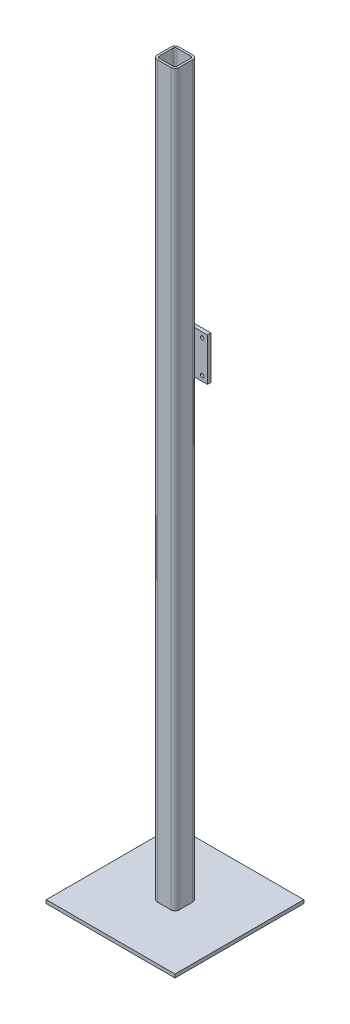
ISO-10303-21;
HEADER;
FILE_DESCRIPTION(('STEP AP214'),'2;1');
FILE_NAME('part.step','',(''),(''),'','','');
FILE_SCHEMA(('AUTOMOTIVE_DESIGN { 1 0 10303 214 1 1 1 1 }'));
ENDSEC;
DATA;
#1=APPLICATION_CONTEXT('core data for automotive mechanical design processes');
#2=APPLICATION_PROTOCOL_DEFINITION('international standard','automotive_design',2000,#1);
#3=PRODUCT_CONTEXT('',#1,'mechanical');
#4=PRODUCT('Part','Part','',(#3));
#5=PRODUCT_RELATED_PRODUCT_CATEGORY('part','',(#4));
#6=PRODUCT_DEFINITION_FORMATION('','',#4);
#7=PRODUCT_DEFINITION_CONTEXT('part definition',#1,'design');
#8=PRODUCT_DEFINITION('design','',#6,#7);
#9=PRODUCT_DEFINITION_SHAPE('','',#8);
#10=(LENGTH_UNIT() NAMED_UNIT(*) SI_UNIT(.MILLI.,.METRE.));
#11=(NAMED_UNIT(*) PLANE_ANGLE_UNIT() SI_UNIT($,.RADIAN.));
#12=(NAMED_UNIT(*) SI_UNIT($,.STERADIAN.) SOLID_ANGLE_UNIT());
#13=UNCERTAINTY_MEASURE_WITH_UNIT(LENGTH_MEASURE(1.E-05),#10,'distance_accuracy_value','');
#14=(GEOMETRIC_REPRESENTATION_CONTEXT(3) GLOBAL_UNCERTAINTY_ASSIGNED_CONTEXT((#13)) GLOBAL_UNIT_ASSIGNED_CONTEXT((#10,
#11,#12)) REPRESENTATION_CONTEXT('',''));
#15=CARTESIAN_POINT('',(0.,0.,0.));
#16=DIRECTION('',(0.,0.,1.));
#17=DIRECTION('',(1.,0.,0.));
#18=AXIS2_PLACEMENT_3D('',#15,#16,#17);
#19=CARTESIAN_POINT('',(0.,0.,-33.4));
#20=DIRECTION('',(0.,0.,-1.));
#21=DIRECTION('',(-1.,0.,0.));
#22=AXIS2_PLACEMENT_3D('',#19,#20,#21);
#23=PLANE('',#22);
#24=CARTESIAN_POINT('',(-38.,1064.,-33.4));
#25=DIRECTION('',(0.,0.,-1.));
#26=DIRECTION('',(-1.,0.,0.));
#27=AXIS2_PLACEMENT_3D('',#24,#25,#26);
#28=CIRCLE('',#27,4.09999999999994);
#29=CARTESIAN_POINT('',(-42.0999999999999,1064.,-33.4));
#30=VERTEX_POINT('',#29);
#31=EDGE_CURVE('E166',#30,#30,#28,.T.);
#32=ORIENTED_EDGE('',*,*,#31,.F.);
#33=EDGE_LOOP('',(#32));
#34=FACE_BOUND('',#33,.T.);
#35=CARTESIAN_POINT('',(38.,1140.,-33.4));
#36=DIRECTION('',(0.,0.,-1.));
#37=DIRECTION('',(-1.,0.,0.));
#38=AXIS2_PLACEMENT_3D('',#35,#36,#37);
#39=CIRCLE('',#38,4.09999999999994);
#40=CARTESIAN_POINT('',(33.9000000000001,1140.,-33.4));
#41=VERTEX_POINT('',#40);
#42=EDGE_CURVE('E145',#41,#41,#39,.T.);
#43=ORIENTED_EDGE('',*,*,#42,.F.);
#44=EDGE_LOOP('',(#43));
#45=FACE_BOUND('',#44,.T.);
#46=DIRECTION('',(0.,1.,0.));
#47=VECTOR('',#46,1.);
#48=CARTESIAN_POINT('',(-50.,1152.,-33.4));
#49=LINE('',#48,#47);
#50=CARTESIAN_POINT('',(-50.,1052.,-33.4));
#51=VERTEX_POINT('',#50);
#52=CARTESIAN_POINT('',(-50.,1152.,-33.4));
#53=VERTEX_POINT('',#52);
#54=EDGE_CURVE('E130',#51,#53,#49,.T.);
#55=ORIENTED_EDGE('',*,*,#54,.T.);
#56=DIRECTION('',(1.,0.,0.));
#57=VECTOR('',#56,1.);
#58=CARTESIAN_POINT('',(50.,1152.,-33.4));
#59=LINE('',#58,#57);
#60=CARTESIAN_POINT('',(50.,1152.,-33.4));
#61=VERTEX_POINT('',#60);
#62=EDGE_CURVE('E125',#53,#61,#59,.T.);
#63=ORIENTED_EDGE('',*,*,#62,.T.);
#64=DIRECTION('',(0.,-1.,0.));
#65=VECTOR('',#64,1.);
#66=CARTESIAN_POINT('',(50.,1152.,-33.4));
#67=LINE('',#66,#65);
#68=CARTESIAN_POINT('',(50.,1052.,-33.4));
#69=VERTEX_POINT('',#68);
#70=EDGE_CURVE('E128',#61,#69,#67,.T.);
#71=ORIENTED_EDGE('',*,*,#70,.T.);
#72=DIRECTION('',(-1.,0.,0.));
#73=VECTOR('',#72,1.);
#74=CARTESIAN_POINT('',(50.,1052.,-33.4));
#75=LINE('',#74,#73);
#76=EDGE_CURVE('E95',#69,#51,#75,.T.);
#77=ORIENTED_EDGE('',*,*,#76,.T.);
#78=EDGE_LOOP('',(#55,#63,#71,#77));
#79=FACE_BOUND('',#78,.T.);
#80=CARTESIAN_POINT('',(-38.,1140.,-33.4));
#81=DIRECTION('',(0.,0.,-1.));
#82=DIRECTION('',(-1.,0.,0.));
#83=AXIS2_PLACEMENT_3D('',#80,#81,#82);
#84=CIRCLE('',#83,4.09999999999994);
#85=CARTESIAN_POINT('',(-42.0999999999999,1140.,-33.4));
#86=VERTEX_POINT('',#85);
#87=EDGE_CURVE('E160',#86,#86,#84,.T.);
#88=ORIENTED_EDGE('',*,*,#87,.F.);
#89=EDGE_LOOP('',(#88));
#90=FACE_BOUND('',#89,.T.);
#91=CARTESIAN_POINT('',(38.,1064.,-33.4));
#92=DIRECTION('',(0.,0.,-1.));
#93=DIRECTION('',(-1.,0.,0.));
#94=AXIS2_PLACEMENT_3D('',#91,#92,#93);
#95=CIRCLE('',#94,4.09999999999994);
#96=CARTESIAN_POINT('',(33.9000000000001,1064.,-33.4));
#97=VERTEX_POINT('',#96);
#98=EDGE_CURVE('E172',#97,#97,#95,.T.);
#99=ORIENTED_EDGE('',*,*,#98,.F.);
#100=EDGE_LOOP('',(#99));
#101=FACE_BOUND('',#100,.T.);
#102=ADVANCED_FACE('F78',(#34,#45,#79,#90,#101),#23,.T.);
#103=CARTESIAN_POINT('',(0.,0.,-25.4));
#104=DIRECTION('',(0.,0.,-1.));
#105=DIRECTION('',(-1.,0.,0.));
#106=AXIS2_PLACEMENT_3D('',#103,#104,#105);
#107=PLANE('',#106);
#108=DIRECTION('',(0.,1.,0.));
#109=VECTOR('',#108,1.);
#110=CARTESIAN_POINT('',(-50.,1152.,-25.4));
#111=LINE('',#110,#109);
#112=CARTESIAN_POINT('',(-50.,1052.,-25.4));
#113=VERTEX_POINT('',#112);
#114=CARTESIAN_POINT('',(-50.,1152.,-25.4));
#115=VERTEX_POINT('',#114);
#116=EDGE_CURVE('E142',#113,#115,#111,.T.);
#117=ORIENTED_EDGE('',*,*,#116,.F.);
#118=DIRECTION('',(-1.,0.,0.));
#119=VECTOR('',#118,1.);
#120=CARTESIAN_POINT('',(50.,1052.,-25.4));
#121=LINE('',#120,#119);
#122=CARTESIAN_POINT('',(50.,1052.,-25.4));
#123=VERTEX_POINT('',#122);
#124=EDGE_CURVE('E118',#123,#113,#121,.T.);
#125=ORIENTED_EDGE('',*,*,#124,.F.);
#126=DIRECTION('',(0.,-1.,0.));
#127=VECTOR('',#126,1.);
#128=CARTESIAN_POINT('',(50.,1152.,-25.4));
#129=LINE('',#128,#127);
#130=CARTESIAN_POINT('',(50.,1152.,-25.4));
#131=VERTEX_POINT('',#130);
#132=EDGE_CURVE('E112',#131,#123,#129,.T.);
#133=ORIENTED_EDGE('',*,*,#132,.F.);
#134=DIRECTION('',(1.,0.,0.));
#135=VECTOR('',#134,1.);
#136=CARTESIAN_POINT('',(50.,1152.,-25.4));
#137=LINE('',#136,#135);
#138=EDGE_CURVE('E134',#115,#131,#137,.T.);
#139=ORIENTED_EDGE('',*,*,#138,.F.);
#140=EDGE_LOOP('',(#117,#125,#133,#139));
#141=FACE_BOUND('',#140,.T.);
#142=CARTESIAN_POINT('',(38.,1140.,-25.4));
#143=DIRECTION('',(0.,0.,-1.));
#144=DIRECTION('',(-1.,0.,0.));
#145=AXIS2_PLACEMENT_3D('',#142,#143,#144);
#146=CIRCLE('',#145,4.09999999999994);
#147=CARTESIAN_POINT('',(33.9000000000001,1140.,-25.4));
#148=VERTEX_POINT('',#147);
#149=EDGE_CURVE('E157',#148,#148,#146,.T.);
#150=ORIENTED_EDGE('',*,*,#149,.T.);
#151=EDGE_LOOP('',(#150));
#152=FACE_BOUND('',#151,.T.);
#153=CARTESIAN_POINT('',(-38.,1140.,-25.4));
#154=DIRECTION('',(0.,0.,-1.));
#155=DIRECTION('',(-1.,0.,0.));
#156=AXIS2_PLACEMENT_3D('',#153,#154,#155);
#157=CIRCLE('',#156,4.09999999999994);
#158=CARTESIAN_POINT('',(-42.0999999999999,1140.,-25.4));
#159=VERTEX_POINT('',#158);
#160=EDGE_CURVE('E163',#159,#159,#157,.T.);
#161=ORIENTED_EDGE('',*,*,#160,.T.);
#162=EDGE_LOOP('',(#161));
#163=FACE_BOUND('',#162,.T.);
#164=CARTESIAN_POINT('',(-38.,1064.,-25.4));
#165=DIRECTION('',(0.,0.,-1.));
#166=DIRECTION('',(-1.,0.,0.));
#167=AXIS2_PLACEMENT_3D('',#164,#165,#166);
#168=CIRCLE('',#167,4.09999999999994);
#169=CARTESIAN_POINT('',(-42.0999999999999,1064.,-25.4));
#170=VERTEX_POINT('',#169);
#171=EDGE_CURVE('E169',#170,#170,#168,.T.);
#172=ORIENTED_EDGE('',*,*,#171,.T.);
#173=EDGE_LOOP('',(#172));
#174=FACE_BOUND('',#173,.T.);
#175=CARTESIAN_POINT('',(38.,1064.,-25.4));
#176=DIRECTION('',(0.,0.,-1.));
#177=DIRECTION('',(-1.,0.,0.));
#178=AXIS2_PLACEMENT_3D('',#175,#176,#177);
#179=CIRCLE('',#178,4.09999999999994);
#180=CARTESIAN_POINT('',(33.9000000000001,1064.,-25.4));
#181=VERTEX_POINT('',#180);
#182=EDGE_CURVE('E175',#181,#181,#179,.T.);
#183=ORIENTED_EDGE('',*,*,#182,.T.);
#184=EDGE_LOOP('',(#183));
#185=FACE_BOUND('',#184,.T.);
#186=ADVANCED_FACE('F153',(#141,#152,#163,#174,#185),#107,.F.);
#187=CARTESIAN_POINT('',(-50.,1152.,-33.4));
#188=DIRECTION('',(1.,0.,0.));
#189=DIRECTION('',(0.,1.,0.));
#190=AXIS2_PLACEMENT_3D('',#187,#188,#189);
#191=PLANE('',#190);
#192=ORIENTED_EDGE('',*,*,#116,.T.);
#193=DIRECTION('',(0.,0.,1.));
#194=VECTOR('',#193,1.);
#195=CARTESIAN_POINT('',(-50.,1152.,-33.4));
#196=LINE('',#195,#194);
#197=EDGE_CURVE('E13',#53,#115,#196,.T.);
#198=ORIENTED_EDGE('',*,*,#197,.F.);
#199=ORIENTED_EDGE('',*,*,#54,.F.);
#200=DIRECTION('',(0.,0.,1.));
#201=VECTOR('',#200,1.);
#202=CARTESIAN_POINT('',(-50.,1052.,-33.4));
#203=LINE('',#202,#201);
#204=EDGE_CURVE('E138',#51,#113,#203,.T.);
#205=ORIENTED_EDGE('',*,*,#204,.T.);
#206=EDGE_LOOP('',(#192,#198,#199,#205));
#207=FACE_BOUND('',#206,.T.);
#208=ADVANCED_FACE('F80',(#207),#191,.F.);
#209=CARTESIAN_POINT('',(50.,1152.,-33.4));
#210=DIRECTION('',(0.,-1.,0.));
#211=DIRECTION('',(0.,0.,-1.));
#212=AXIS2_PLACEMENT_3D('',#209,#210,#211);
#213=PLANE('',#212);
#214=ORIENTED_EDGE('',*,*,#138,.T.);
#215=DIRECTION('',(0.,0.,1.));
#216=VECTOR('',#215,1.);
#217=CARTESIAN_POINT('',(50.,1152.,-33.4));
#218=LINE('',#217,#216);
#219=EDGE_CURVE('E87',#61,#131,#218,.T.);
#220=ORIENTED_EDGE('',*,*,#219,.F.);
#221=ORIENTED_EDGE('',*,*,#62,.F.);
#222=ORIENTED_EDGE('',*,*,#197,.T.);
#223=EDGE_LOOP('',(#214,#220,#221,#222));
#224=FACE_BOUND('',#223,.T.);
#225=ADVANCED_FACE('F133',(#224),#213,.F.);
#226=CARTESIAN_POINT('',(50.,1152.,-33.4));
#227=DIRECTION('',(-1.,0.,0.));
#228=DIRECTION('',(0.,-1.,0.));
#229=AXIS2_PLACEMENT_3D('',#226,#227,#228);
#230=PLANE('',#229);
#231=ORIENTED_EDGE('',*,*,#132,.T.);
#232=DIRECTION('',(0.,0.,1.));
#233=VECTOR('',#232,1.);
#234=CARTESIAN_POINT('',(50.,1052.,-33.4));
#235=LINE('',#234,#233);
#236=EDGE_CURVE('E135',#69,#123,#235,.T.);
#237=ORIENTED_EDGE('',*,*,#236,.F.);
#238=ORIENTED_EDGE('',*,*,#70,.F.);
#239=ORIENTED_EDGE('',*,*,#219,.T.);
#240=EDGE_LOOP('',(#231,#237,#238,#239));
#241=FACE_BOUND('',#240,.T.);
#242=ADVANCED_FACE('F136',(#241),#230,.F.);
#243=CARTESIAN_POINT('',(50.,1052.,-33.4));
#244=DIRECTION('',(0.,1.,0.));
#245=DIRECTION('',(0.,0.,1.));
#246=AXIS2_PLACEMENT_3D('',#243,#244,#245);
#247=PLANE('',#246);
#248=ORIENTED_EDGE('',*,*,#124,.T.);
#249=ORIENTED_EDGE('',*,*,#204,.F.);
#250=ORIENTED_EDGE('',*,*,#76,.F.);
#251=ORIENTED_EDGE('',*,*,#236,.T.);
#252=EDGE_LOOP('',(#248,#249,#250,#251));
#253=FACE_BOUND('',#252,.T.);
#254=ADVANCED_FACE('F150',(#253),#247,.F.);
#255=CARTESIAN_POINT('',(38.,1140.,-33.4));
#256=DIRECTION('',(0.,0.,1.));
#257=DIRECTION('',(1.,0.,0.));
#258=AXIS2_PLACEMENT_3D('',#255,#256,#257);
#259=CYLINDRICAL_SURFACE('',#258,4.09999999999994);
#260=ORIENTED_EDGE('',*,*,#42,.T.);
#261=EDGE_LOOP('',(#260));
#262=FACE_BOUND('',#261,.T.);
#263=ORIENTED_EDGE('',*,*,#149,.F.);
#264=EDGE_LOOP('',(#263));
#265=FACE_BOUND('',#264,.T.);
#266=ADVANCED_FACE('F194',(#262,#265),#259,.F.);
#267=CARTESIAN_POINT('',(-38.,1140.,-33.4));
#268=DIRECTION('',(0.,0.,1.));
#269=DIRECTION('',(1.,0.,0.));
#270=AXIS2_PLACEMENT_3D('',#267,#268,#269);
#271=CYLINDRICAL_SURFACE('',#270,4.09999999999994);
#272=ORIENTED_EDGE('',*,*,#87,.T.);
#273=EDGE_LOOP('',(#272));
#274=FACE_BOUND('',#273,.T.);
#275=ORIENTED_EDGE('',*,*,#160,.F.);
#276=EDGE_LOOP('',(#275));
#277=FACE_BOUND('',#276,.T.);
#278=ADVANCED_FACE('F240',(#274,#277),#271,.F.);
#279=CARTESIAN_POINT('',(-38.,1064.,-33.4));
#280=DIRECTION('',(0.,0.,1.));
#281=DIRECTION('',(1.,0.,0.));
#282=AXIS2_PLACEMENT_3D('',#279,#280,#281);
#283=CYLINDRICAL_SURFACE('',#282,4.09999999999994);
#284=ORIENTED_EDGE('',*,*,#31,.T.);
#285=EDGE_LOOP('',(#284));
#286=FACE_BOUND('',#285,.T.);
#287=ORIENTED_EDGE('',*,*,#171,.F.);
#288=EDGE_LOOP('',(#287));
#289=FACE_BOUND('',#288,.T.);
#290=ADVANCED_FACE('F248',(#286,#289),#283,.F.);
#291=CARTESIAN_POINT('',(38.,1064.,-33.4));
#292=DIRECTION('',(0.,0.,1.));
#293=DIRECTION('',(1.,0.,0.));
#294=AXIS2_PLACEMENT_3D('',#291,#292,#293);
#295=CYLINDRICAL_SURFACE('',#294,4.09999999999994);
#296=ORIENTED_EDGE('',*,*,#98,.T.);
#297=EDGE_LOOP('',(#296));
#298=FACE_BOUND('',#297,.T.);
#299=ORIENTED_EDGE('',*,*,#182,.F.);
#300=EDGE_LOOP('',(#299));
#301=FACE_BOUND('',#300,.T.);
#302=ADVANCED_FACE('F181',(#298,#301),#295,.F.);
#303=CLOSED_SHELL('',(#102,#186,#208,#225,#242,#254,#266,#278,#290,#302));
#304=MANIFOLD_SOLID_BREP('B2',#303);
#305=CARTESIAN_POINT('',(150.,-8.00000000000001,150.));
#306=DIRECTION('',(-1.,0.,0.));
#307=DIRECTION('',(0.,0.,1.));
#308=AXIS2_PLACEMENT_3D('',#305,#306,#307);
#309=PLANE('',#308);
#310=DIRECTION('',(0.,0.,1.));
#311=VECTOR('',#310,1.);
#312=CARTESIAN_POINT('',(150.,0.,150.));
#313=LINE('',#312,#311);
#314=CARTESIAN_POINT('',(150.,0.,-150.));
#315=VERTEX_POINT('',#314);
#316=CARTESIAN_POINT('',(150.,0.,150.));
#317=VERTEX_POINT('',#316);
#318=EDGE_CURVE('E358',#315,#317,#313,.T.);
#319=ORIENTED_EDGE('',*,*,#318,.T.);
#320=DIRECTION('',(0.,1.,0.));
#321=VECTOR('',#320,1.);
#322=CARTESIAN_POINT('',(150.,-8.00000000000001,150.));
#323=LINE('',#322,#321);
#324=CARTESIAN_POINT('',(150.,-8.00000000000001,150.));
#325=VERTEX_POINT('',#324);
#326=EDGE_CURVE('E76',#325,#317,#323,.T.);
#327=ORIENTED_EDGE('',*,*,#326,.F.);
#328=DIRECTION('',(0.,0.,1.));
#329=VECTOR('',#328,1.);
#330=CARTESIAN_POINT('',(150.,-8.00000000000001,150.));
#331=LINE('',#330,#329);
#332=CARTESIAN_POINT('',(150.,-7.99999999999999,-150.));
#333=VERTEX_POINT('',#332);
#334=EDGE_CURVE('E346',#333,#325,#331,.T.);
#335=ORIENTED_EDGE('',*,*,#334,.F.);
#336=DIRECTION('',(0.,1.,0.));
#337=VECTOR('',#336,1.);
#338=CARTESIAN_POINT('',(150.,-7.99999999999999,-150.));
#339=LINE('',#338,#337);
#340=EDGE_CURVE('E354',#333,#315,#339,.T.);
#341=ORIENTED_EDGE('',*,*,#340,.T.);
#342=EDGE_LOOP('',(#319,#327,#335,#341));
#343=FACE_BOUND('',#342,.T.);
#344=ADVANCED_FACE('F295',(#343),#309,.F.);
#345=CARTESIAN_POINT('',(-150.,-8.00000000000001,150.));
#346=DIRECTION('',(0.,0.,-1.));
#347=DIRECTION('',(0.,1.,0.));
#348=AXIS2_PLACEMENT_3D('',#345,#346,#347);
#349=PLANE('',#348);
#350=DIRECTION('',(-1.,0.,0.));
#351=VECTOR('',#350,1.);
#352=CARTESIAN_POINT('',(-150.,0.,150.));
#353=LINE('',#352,#351);
#354=CARTESIAN_POINT('',(-150.,0.,150.));
#355=VERTEX_POINT('',#354);
#356=EDGE_CURVE('E350',#317,#355,#353,.T.);
#357=ORIENTED_EDGE('',*,*,#356,.T.);
#358=DIRECTION('',(0.,1.,0.));
#359=VECTOR('',#358,1.);
#360=CARTESIAN_POINT('',(-150.,-8.00000000000001,150.));
#361=LINE('',#360,#359);
#362=CARTESIAN_POINT('',(-150.,-8.00000000000001,150.));
#363=VERTEX_POINT('',#362);
#364=EDGE_CURVE('E303',#363,#355,#361,.T.);
#365=ORIENTED_EDGE('',*,*,#364,.F.);
#366=DIRECTION('',(-1.,0.,0.));
#367=VECTOR('',#366,1.);
#368=CARTESIAN_POINT('',(-150.,-8.00000000000001,150.));
#369=LINE('',#368,#367);
#370=EDGE_CURVE('E341',#325,#363,#369,.T.);
#371=ORIENTED_EDGE('',*,*,#370,.F.);
#372=ORIENTED_EDGE('',*,*,#326,.T.);
#373=EDGE_LOOP('',(#357,#365,#371,#372));
#374=FACE_BOUND('',#373,.T.);
#375=ADVANCED_FACE('F349',(#374),#349,.F.);
#376=CARTESIAN_POINT('',(-150.,-8.00000000000001,150.));
#377=DIRECTION('',(1.,0.,0.));
#378=DIRECTION('',(0.,0.,-1.));
#379=AXIS2_PLACEMENT_3D('',#376,#377,#378);
#380=PLANE('',#379);
#381=DIRECTION('',(0.,0.,-1.));
#382=VECTOR('',#381,1.);
#383=CARTESIAN_POINT('',(-150.,0.,150.));
#384=LINE('',#383,#382);
#385=CARTESIAN_POINT('',(-150.,0.,-150.));
#386=VERTEX_POINT('',#385);
#387=EDGE_CURVE('E328',#355,#386,#384,.T.);
#388=ORIENTED_EDGE('',*,*,#387,.T.);
#389=DIRECTION('',(0.,1.,0.));
#390=VECTOR('',#389,1.);
#391=CARTESIAN_POINT('',(-150.,-7.99999999999999,-150.));
#392=LINE('',#391,#390);
#393=CARTESIAN_POINT('',(-150.,-7.99999999999999,-150.));
#394=VERTEX_POINT('',#393);
#395=EDGE_CURVE('E351',#394,#386,#392,.T.);
#396=ORIENTED_EDGE('',*,*,#395,.F.);
#397=DIRECTION('',(0.,0.,-1.));
#398=VECTOR('',#397,1.);
#399=CARTESIAN_POINT('',(-150.,-8.00000000000001,150.));
#400=LINE('',#399,#398);
#401=EDGE_CURVE('E344',#363,#394,#400,.T.);
#402=ORIENTED_EDGE('',*,*,#401,.F.);
#403=ORIENTED_EDGE('',*,*,#364,.T.);
#404=EDGE_LOOP('',(#388,#396,#402,#403));
#405=FACE_BOUND('',#404,.T.);
#406=ADVANCED_FACE('F352',(#405),#380,.F.);
#407=CARTESIAN_POINT('',(-150.,-7.99999999999999,-150.));
#408=DIRECTION('',(0.,0.,1.));
#409=DIRECTION('',(0.,-1.,0.));
#410=AXIS2_PLACEMENT_3D('',#407,#408,#409);
#411=PLANE('',#410);
#412=DIRECTION('',(1.,0.,0.));
#413=VECTOR('',#412,1.);
#414=CARTESIAN_POINT('',(-150.,0.,-150.));
#415=LINE('',#414,#413);
#416=EDGE_CURVE('E334',#386,#315,#415,.T.);
#417=ORIENTED_EDGE('',*,*,#416,.T.);
#418=ORIENTED_EDGE('',*,*,#340,.F.);
#419=DIRECTION('',(1.,0.,0.));
#420=VECTOR('',#419,1.);
#421=CARTESIAN_POINT('',(-150.,-7.99999999999999,-150.));
#422=LINE('',#421,#420);
#423=EDGE_CURVE('E311',#394,#333,#422,.T.);
#424=ORIENTED_EDGE('',*,*,#423,.F.);
#425=ORIENTED_EDGE('',*,*,#395,.T.);
#426=EDGE_LOOP('',(#417,#418,#424,#425));
#427=FACE_BOUND('',#426,.T.);
#428=ADVANCED_FACE('F365',(#427),#411,.F.);
#429=CARTESIAN_POINT('',(0.,-8.,0.));
#430=DIRECTION('',(0.,-1.,0.));
#431=DIRECTION('',(0.,0.,-1.));
#432=AXIS2_PLACEMENT_3D('',#429,#430,#431);
#433=PLANE('',#432);
#434=ORIENTED_EDGE('',*,*,#334,.T.);
#435=ORIENTED_EDGE('',*,*,#370,.T.);
#436=ORIENTED_EDGE('',*,*,#401,.T.);
#437=ORIENTED_EDGE('',*,*,#423,.T.);
#438=EDGE_LOOP('',(#434,#435,#436,#437));
#439=FACE_BOUND('',#438,.T.);
#440=ADVANCED_FACE('F342',(#439),#433,.T.);
#441=CARTESIAN_POINT('',(0.,0.,0.));
#442=DIRECTION('',(0.,-1.,0.));
#443=DIRECTION('',(0.,0.,-1.));
#444=AXIS2_PLACEMENT_3D('',#441,#442,#443);
#445=PLANE('',#444);
#446=ORIENTED_EDGE('',*,*,#318,.F.);
#447=ORIENTED_EDGE('',*,*,#416,.F.);
#448=ORIENTED_EDGE('',*,*,#387,.F.);
#449=ORIENTED_EDGE('',*,*,#356,.F.);
#450=EDGE_LOOP('',(#446,#447,#448,#449));
#451=FACE_BOUND('',#450,.T.);
#452=ADVANCED_FACE('F368',(#451),#445,.F.);
#453=CLOSED_SHELL('',(#344,#375,#406,#428,#440,#452));
#454=MANIFOLD_SOLID_BREP('B7',#453);
#455=CARTESIAN_POINT('',(15.875,1700.,-15.875));
#456=DIRECTION('',(0.,-1.,0.));
#457=DIRECTION('',(0.,0.,-1.));
#458=AXIS2_PLACEMENT_3D('',#455,#456,#457);
#459=CYLINDRICAL_SURFACE('',#458,9.525);
#460=CARTESIAN_POINT('',(15.875,0.,-15.875));
#461=DIRECTION('',(0.,1.,0.));
#462=DIRECTION('',(0.,0.,1.));
#463=AXIS2_PLACEMENT_3D('',#460,#461,#462);
#464=CIRCLE('',#463,9.525);
#465=CARTESIAN_POINT('',(25.4,0.,-15.875));
#466=VERTEX_POINT('',#465);
#467=CARTESIAN_POINT('',(15.875,0.,-25.4));
#468=VERTEX_POINT('',#467);
#469=EDGE_CURVE('E578',#466,#468,#464,.T.);
#470=ORIENTED_EDGE('',*,*,#469,.T.);
#471=DIRECTION('',(0.,-1.,0.));
#472=VECTOR('',#471,1.);
#473=CARTESIAN_POINT('',(15.875,1700.,-25.4));
#474=LINE('',#473,#472);
#475=CARTESIAN_POINT('',(15.875,1700.,-25.4));
#476=VERTEX_POINT('',#475);
#477=EDGE_CURVE('E293',#476,#468,#474,.T.);
#478=ORIENTED_EDGE('',*,*,#477,.F.);
#479=CARTESIAN_POINT('',(15.875,1700.,-15.875));
#480=DIRECTION('',(0.,1.,0.));
#481=DIRECTION('',(0.,0.,1.));
#482=AXIS2_PLACEMENT_3D('',#479,#480,#481);
#483=CIRCLE('',#482,9.525);
#484=CARTESIAN_POINT('',(25.4,1700.,-15.875));
#485=VERTEX_POINT('',#484);
#486=EDGE_CURVE('E656',#485,#476,#483,.T.);
#487=ORIENTED_EDGE('',*,*,#486,.F.);
#488=DIRECTION('',(0.,-1.,0.));
#489=VECTOR('',#488,1.);
#490=CARTESIAN_POINT('',(25.4,1700.,-15.875));
#491=LINE('',#490,#489);
#492=EDGE_CURVE('E593',#485,#466,#491,.T.);
#493=ORIENTED_EDGE('',*,*,#492,.T.);
#494=EDGE_LOOP('',(#470,#478,#487,#493));
#495=FACE_BOUND('',#494,.T.);
#496=ADVANCED_FACE('F406',(#495),#459,.T.);
#497=CARTESIAN_POINT('',(15.875,1700.,-25.4));
#498=DIRECTION('',(0.,0.,1.));
#499=DIRECTION('',(1.,0.,0.));
#500=AXIS2_PLACEMENT_3D('',#497,#498,#499);
#501=PLANE('',#500);
#502=DIRECTION('',(-1.,0.,0.));
#503=VECTOR('',#502,1.);
#504=CARTESIAN_POINT('',(15.875,0.,-25.4));
#505=LINE('',#504,#503);
#506=CARTESIAN_POINT('',(-15.875,0.,-25.4));
#507=VERTEX_POINT('',#506);
#508=EDGE_CURVE('E581',#468,#507,#505,.T.);
#509=ORIENTED_EDGE('',*,*,#508,.T.);
#510=DIRECTION('',(0.,-1.,0.));
#511=VECTOR('',#510,1.);
#512=CARTESIAN_POINT('',(-15.875,1700.,-25.4));
#513=LINE('',#512,#511);
#514=CARTESIAN_POINT('',(-15.875,1700.,-25.4));
#515=VERTEX_POINT('',#514);
#516=EDGE_CURVE('E416',#515,#507,#513,.T.);
#517=ORIENTED_EDGE('',*,*,#516,.F.);
#518=DIRECTION('',(-1.,0.,0.));
#519=VECTOR('',#518,1.);
#520=CARTESIAN_POINT('',(15.875,1700.,-25.4));
#521=LINE('',#520,#519);
#522=EDGE_CURVE('E658',#476,#515,#521,.T.);
#523=ORIENTED_EDGE('',*,*,#522,.F.);
#524=ORIENTED_EDGE('',*,*,#477,.T.);
#525=EDGE_LOOP('',(#509,#517,#523,#524));
#526=FACE_BOUND('',#525,.T.);
#527=ADVANCED_FACE('F693',(#526),#501,.F.);
#528=CARTESIAN_POINT('',(-15.875,1700.,-15.875));
#529=DIRECTION('',(0.,-1.,0.));
#530=DIRECTION('',(0.,0.,-1.));
#531=AXIS2_PLACEMENT_3D('',#528,#529,#530);
#532=CYLINDRICAL_SURFACE('',#531,9.525);
#533=CARTESIAN_POINT('',(-15.875,0.,-15.875));
#534=DIRECTION('',(0.,1.,0.));
#535=DIRECTION('',(0.,0.,1.));
#536=AXIS2_PLACEMENT_3D('',#533,#534,#535);
#537=CIRCLE('',#536,9.525);
#538=CARTESIAN_POINT('',(-25.4,0.,-15.875));
#539=VERTEX_POINT('',#538);
#540=EDGE_CURVE('E583',#507,#539,#537,.T.);
#541=ORIENTED_EDGE('',*,*,#540,.T.);
#542=DIRECTION('',(0.,-1.,0.));
#543=VECTOR('',#542,1.);
#544=CARTESIAN_POINT('',(-25.4,1700.,-15.875));
#545=LINE('',#544,#543);
#546=CARTESIAN_POINT('',(-25.4,1700.,-15.875));
#547=VERTEX_POINT('',#546);
#548=EDGE_CURVE('E600',#547,#539,#545,.T.);
#549=ORIENTED_EDGE('',*,*,#548,.F.);
#550=CARTESIAN_POINT('',(-15.875,1700.,-15.875));
#551=DIRECTION('',(0.,1.,0.));
#552=DIRECTION('',(0.,0.,1.));
#553=AXIS2_PLACEMENT_3D('',#550,#551,#552);
#554=CIRCLE('',#553,9.525);
#555=EDGE_CURVE('E660',#515,#547,#554,.T.);
#556=ORIENTED_EDGE('',*,*,#555,.F.);
#557=ORIENTED_EDGE('',*,*,#516,.T.);
#558=EDGE_LOOP('',(#541,#549,#556,#557));
#559=FACE_BOUND('',#558,.T.);
#560=ADVANCED_FACE('F698',(#559),#532,.T.);
#561=CARTESIAN_POINT('',(-25.4,1700.,15.875));
#562=DIRECTION('',(1.,0.,0.));
#563=DIRECTION('',(0.,0.,-1.));
#564=AXIS2_PLACEMENT_3D('',#561,#562,#563);
#565=PLANE('',#564);
#566=DIRECTION('',(0.,0.,1.));
#567=VECTOR('',#566,1.);
#568=CARTESIAN_POINT('',(-25.4,0.,15.875));
#569=LINE('',#568,#567);
#570=CARTESIAN_POINT('',(-25.4,0.,15.875));
#571=VERTEX_POINT('',#570);
#572=EDGE_CURVE('E585',#539,#571,#569,.T.);
#573=ORIENTED_EDGE('',*,*,#572,.T.);
#574=DIRECTION('',(0.,-1.,0.));
#575=VECTOR('',#574,1.);
#576=CARTESIAN_POINT('',(-25.4,1700.,15.875));
#577=LINE('',#576,#575);
#578=CARTESIAN_POINT('',(-25.4,1700.,15.875));
#579=VERTEX_POINT('',#578);
#580=EDGE_CURVE('E597',#579,#571,#577,.T.);
#581=ORIENTED_EDGE('',*,*,#580,.F.);
#582=DIRECTION('',(0.,0.,1.));
#583=VECTOR('',#582,1.);
#584=CARTESIAN_POINT('',(-25.4,1700.,15.875));
#585=LINE('',#584,#583);
#586=EDGE_CURVE('E662',#547,#579,#585,.T.);
#587=ORIENTED_EDGE('',*,*,#586,.F.);
#588=ORIENTED_EDGE('',*,*,#548,.T.);
#589=EDGE_LOOP('',(#573,#581,#587,#588));
#590=FACE_BOUND('',#589,.T.);
#591=ADVANCED_FACE('F668',(#590),#565,.F.);
#592=CARTESIAN_POINT('',(-15.875,1700.,15.875));
#593=DIRECTION('',(0.,-1.,0.));
#594=DIRECTION('',(0.,0.,-1.));
#595=AXIS2_PLACEMENT_3D('',#592,#593,#594);
#596=CYLINDRICAL_SURFACE('',#595,9.52499999999999);
#597=CARTESIAN_POINT('',(-15.875,0.,15.875));
#598=DIRECTION('',(0.,1.,0.));
#599=DIRECTION('',(0.,0.,1.));
#600=AXIS2_PLACEMENT_3D('',#597,#598,#599);
#601=CIRCLE('',#600,9.52499999999999);
#602=CARTESIAN_POINT('',(-15.875,0.,25.4));
#603=VERTEX_POINT('',#602);
#604=EDGE_CURVE('E587',#571,#603,#601,.T.);
#605=ORIENTED_EDGE('',*,*,#604,.T.);
#606=DIRECTION('',(0.,-1.,0.));
#607=VECTOR('',#606,1.);
#608=CARTESIAN_POINT('',(-15.875,1700.,25.4));
#609=LINE('',#608,#607);
#610=CARTESIAN_POINT('',(-15.875,1700.,25.4));
#611=VERTEX_POINT('',#610);
#612=EDGE_CURVE('E545',#611,#603,#609,.T.);
#613=ORIENTED_EDGE('',*,*,#612,.F.);
#614=CARTESIAN_POINT('',(-15.875,1700.,15.875));
#615=DIRECTION('',(0.,1.,0.));
#616=DIRECTION('',(0.,0.,1.));
#617=AXIS2_PLACEMENT_3D('',#614,#615,#616);
#618=CIRCLE('',#617,9.52499999999999);
#619=EDGE_CURVE('E536',#579,#611,#618,.T.);
#620=ORIENTED_EDGE('',*,*,#619,.F.);
#621=ORIENTED_EDGE('',*,*,#580,.T.);
#622=EDGE_LOOP('',(#605,#613,#620,#621));
#623=FACE_BOUND('',#622,.T.);
#624=ADVANCED_FACE('F672',(#623),#596,.T.);
#625=CARTESIAN_POINT('',(-15.875,1700.,25.4));
#626=DIRECTION('',(0.,0.,-1.));
#627=DIRECTION('',(-1.,0.,0.));
#628=AXIS2_PLACEMENT_3D('',#625,#626,#627);
#629=PLANE('',#628);
#630=DIRECTION('',(1.,0.,0.));
#631=VECTOR('',#630,1.);
#632=CARTESIAN_POINT('',(-15.875,0.,25.4));
#633=LINE('',#632,#631);
#634=CARTESIAN_POINT('',(15.875,0.,25.4));
#635=VERTEX_POINT('',#634);
#636=EDGE_CURVE('E544',#603,#635,#633,.T.);
#637=ORIENTED_EDGE('',*,*,#636,.T.);
#638=DIRECTION('',(0.,-1.,0.));
#639=VECTOR('',#638,1.);
#640=CARTESIAN_POINT('',(15.875,1700.,25.4));
#641=LINE('',#640,#639);
#642=CARTESIAN_POINT('',(15.875,1700.,25.4));
#643=VERTEX_POINT('',#642);
#644=EDGE_CURVE('E541',#643,#635,#641,.T.);
#645=ORIENTED_EDGE('',*,*,#644,.F.);
#646=DIRECTION('',(1.,0.,0.));
#647=VECTOR('',#646,1.);
#648=CARTESIAN_POINT('',(-15.875,1700.,25.4));
#649=LINE('',#648,#647);
#650=EDGE_CURVE('E530',#611,#643,#649,.T.);
#651=ORIENTED_EDGE('',*,*,#650,.F.);
#652=ORIENTED_EDGE('',*,*,#612,.T.);
#653=EDGE_LOOP('',(#637,#645,#651,#652));
#654=FACE_BOUND('',#653,.T.);
#655=ADVANCED_FACE('F542',(#654),#629,.F.);
#656=CARTESIAN_POINT('',(15.875,1700.,15.875));
#657=DIRECTION('',(0.,-1.,0.));
#658=DIRECTION('',(0.,0.,-1.));
#659=AXIS2_PLACEMENT_3D('',#656,#657,#658);
#660=CYLINDRICAL_SURFACE('',#659,9.525);
#661=CARTESIAN_POINT('',(15.875,0.,15.875));
#662=DIRECTION('',(0.,1.,0.));
#663=DIRECTION('',(0.,0.,1.));
#664=AXIS2_PLACEMENT_3D('',#661,#662,#663);
#665=CIRCLE('',#664,9.525);
#666=CARTESIAN_POINT('',(25.4,0.,15.875));
#667=VERTEX_POINT('',#666);
#668=EDGE_CURVE('E478',#635,#667,#665,.T.);
#669=ORIENTED_EDGE('',*,*,#668,.T.);
#670=DIRECTION('',(0.,-1.,0.));
#671=VECTOR('',#670,1.);
#672=CARTESIAN_POINT('',(25.4,1700.,15.875));
#673=LINE('',#672,#671);
#674=CARTESIAN_POINT('',(25.4,1700.,15.875));
#675=VERTEX_POINT('',#674);
#676=EDGE_CURVE('E546',#675,#667,#673,.T.);
#677=ORIENTED_EDGE('',*,*,#676,.F.);
#678=CARTESIAN_POINT('',(15.875,1700.,15.875));
#679=DIRECTION('',(0.,1.,0.));
#680=DIRECTION('',(0.,0.,1.));
#681=AXIS2_PLACEMENT_3D('',#678,#679,#680);
#682=CIRCLE('',#681,9.525);
#683=EDGE_CURVE('E534',#643,#675,#682,.T.);
#684=ORIENTED_EDGE('',*,*,#683,.F.);
#685=ORIENTED_EDGE('',*,*,#644,.T.);
#686=EDGE_LOOP('',(#669,#677,#684,#685));
#687=FACE_BOUND('',#686,.T.);
#688=ADVANCED_FACE('F548',(#687),#660,.T.);
#689=CARTESIAN_POINT('',(-15.875,1700.,-15.875));
#690=DIRECTION('',(0.,-1.,0.));
#691=DIRECTION('',(0.,0.,-1.));
#692=AXIS2_PLACEMENT_3D('',#689,#690,#691);
#693=CYLINDRICAL_SURFACE('',#692,4.7625);
#694=CARTESIAN_POINT('',(-15.875,0.,-15.875));
#695=DIRECTION('',(0.,1.,0.));
#696=DIRECTION('',(0.,0.,1.));
#697=AXIS2_PLACEMENT_3D('',#694,#695,#696);
#698=CIRCLE('',#697,4.7625);
#699=CARTESIAN_POINT('',(-15.875,0.,-20.6375));
#700=VERTEX_POINT('',#699);
#701=CARTESIAN_POINT('',(-20.6375,0.,-15.875));
#702=VERTEX_POINT('',#701);
#703=EDGE_CURVE('E554',#700,#702,#698,.T.);
#704=ORIENTED_EDGE('',*,*,#703,.F.);
#705=DIRECTION('',(0.,-1.,0.));
#706=VECTOR('',#705,1.);
#707=CARTESIAN_POINT('',(-15.875,1700.,-20.6375));
#708=LINE('',#707,#706);
#709=CARTESIAN_POINT('',(-15.875,1700.,-20.6375));
#710=VERTEX_POINT('',#709);
#711=EDGE_CURVE('E410',#710,#700,#708,.T.);
#712=ORIENTED_EDGE('',*,*,#711,.F.);
#713=CARTESIAN_POINT('',(-15.875,1700.,-15.875));
#714=DIRECTION('',(0.,1.,0.));
#715=DIRECTION('',(0.,0.,1.));
#716=AXIS2_PLACEMENT_3D('',#713,#714,#715);
#717=CIRCLE('',#716,4.7625);
#718=CARTESIAN_POINT('',(-20.6375,1700.,-15.875));
#719=VERTEX_POINT('',#718);
#720=EDGE_CURVE('E592',#710,#719,#717,.T.);
#721=ORIENTED_EDGE('',*,*,#720,.T.);
#722=DIRECTION('',(0.,-1.,0.));
#723=VECTOR('',#722,1.);
#724=CARTESIAN_POINT('',(-20.6375,1700.,-15.875));
#725=LINE('',#724,#723);
#726=EDGE_CURVE('E550',#719,#702,#725,.T.);
#727=ORIENTED_EDGE('',*,*,#726,.T.);
#728=EDGE_LOOP('',(#704,#712,#721,#727));
#729=FACE_BOUND('',#728,.T.);
#730=ADVANCED_FACE('F408',(#729),#693,.F.);
#731=CARTESIAN_POINT('',(15.875,1700.,-20.6375));
#732=DIRECTION('',(0.,0.,1.));
#733=DIRECTION('',(1.,0.,0.));
#734=AXIS2_PLACEMENT_3D('',#731,#732,#733);
#735=PLANE('',#734);
#736=DIRECTION('',(-1.,0.,0.));
#737=VECTOR('',#736,1.);
#738=CARTESIAN_POINT('',(15.875,0.,-20.6375));
#739=LINE('',#738,#737);
#740=CARTESIAN_POINT('',(15.875,0.,-20.6375));
#741=VERTEX_POINT('',#740);
#742=EDGE_CURVE('E557',#741,#700,#739,.T.);
#743=ORIENTED_EDGE('',*,*,#742,.F.);
#744=DIRECTION('',(0.,-1.,0.));
#745=VECTOR('',#744,1.);
#746=CARTESIAN_POINT('',(15.875,1700.,-20.6375));
#747=LINE('',#746,#745);
#748=CARTESIAN_POINT('',(15.875,1700.,-20.6375));
#749=VERTEX_POINT('',#748);
#750=EDGE_CURVE('E615',#749,#741,#747,.T.);
#751=ORIENTED_EDGE('',*,*,#750,.F.);
#752=DIRECTION('',(-1.,0.,0.));
#753=VECTOR('',#752,1.);
#754=CARTESIAN_POINT('',(15.875,1700.,-20.6375));
#755=LINE('',#754,#753);
#756=EDGE_CURVE('E624',#749,#710,#755,.T.);
#757=ORIENTED_EDGE('',*,*,#756,.T.);
#758=ORIENTED_EDGE('',*,*,#711,.T.);
#759=EDGE_LOOP('',(#743,#751,#757,#758));
#760=FACE_BOUND('',#759,.T.);
#761=ADVANCED_FACE('F622',(#760),#735,.T.);
#762=CARTESIAN_POINT('',(15.875,1700.,-15.875));
#763=DIRECTION('',(0.,-1.,0.));
#764=DIRECTION('',(0.,0.,-1.));
#765=AXIS2_PLACEMENT_3D('',#762,#763,#764);
#766=CYLINDRICAL_SURFACE('',#765,4.7625);
#767=CARTESIAN_POINT('',(15.875,0.,-15.875));
#768=DIRECTION('',(0.,1.,0.));
#769=DIRECTION('',(0.,0.,1.));
#770=AXIS2_PLACEMENT_3D('',#767,#768,#769);
#771=CIRCLE('',#770,4.7625);
#772=CARTESIAN_POINT('',(20.6375,0.,-15.875));
#773=VERTEX_POINT('',#772);
#774=EDGE_CURVE('E560',#773,#741,#771,.T.);
#775=ORIENTED_EDGE('',*,*,#774,.F.);
#776=DIRECTION('',(0.,-1.,0.));
#777=VECTOR('',#776,1.);
#778=CARTESIAN_POINT('',(20.6375,1700.,-15.875));
#779=LINE('',#778,#777);
#780=CARTESIAN_POINT('',(20.6375,1700.,-15.875));
#781=VERTEX_POINT('',#780);
#782=EDGE_CURVE('E614',#781,#773,#779,.T.);
#783=ORIENTED_EDGE('',*,*,#782,.F.);
#784=CARTESIAN_POINT('',(15.875,1700.,-15.875));
#785=DIRECTION('',(0.,1.,0.));
#786=DIRECTION('',(0.,0.,1.));
#787=AXIS2_PLACEMENT_3D('',#784,#785,#786);
#788=CIRCLE('',#787,4.7625);
#789=EDGE_CURVE('E632',#781,#749,#788,.T.);
#790=ORIENTED_EDGE('',*,*,#789,.T.);
#791=ORIENTED_EDGE('',*,*,#750,.T.);
#792=EDGE_LOOP('',(#775,#783,#790,#791));
#793=FACE_BOUND('',#792,.T.);
#794=ADVANCED_FACE('F630',(#793),#766,.F.);
#795=CARTESIAN_POINT('',(20.6375,1700.,-15.875));
#796=DIRECTION('',(-1.,0.,0.));
#797=DIRECTION('',(0.,0.,1.));
#798=AXIS2_PLACEMENT_3D('',#795,#796,#797);
#799=PLANE('',#798);
#800=DIRECTION('',(0.,0.,-1.));
#801=VECTOR('',#800,1.);
#802=CARTESIAN_POINT('',(20.6375,0.,-15.875));
#803=LINE('',#802,#801);
#804=CARTESIAN_POINT('',(20.6375,0.,15.875));
#805=VERTEX_POINT('',#804);
#806=EDGE_CURVE('E563',#805,#773,#803,.T.);
#807=ORIENTED_EDGE('',*,*,#806,.F.);
#808=DIRECTION('',(0.,-1.,0.));
#809=VECTOR('',#808,1.);
#810=CARTESIAN_POINT('',(20.6375,1700.,15.875));
#811=LINE('',#810,#809);
#812=CARTESIAN_POINT('',(20.6375,1700.,15.875));
#813=VERTEX_POINT('',#812);
#814=EDGE_CURVE('E612',#813,#805,#811,.T.);
#815=ORIENTED_EDGE('',*,*,#814,.F.);
#816=DIRECTION('',(0.,0.,-1.));
#817=VECTOR('',#816,1.);
#818=CARTESIAN_POINT('',(20.6375,1700.,-15.875));
#819=LINE('',#818,#817);
#820=EDGE_CURVE('E638',#813,#781,#819,.T.);
#821=ORIENTED_EDGE('',*,*,#820,.T.);
#822=ORIENTED_EDGE('',*,*,#782,.T.);
#823=EDGE_LOOP('',(#807,#815,#821,#822));
#824=FACE_BOUND('',#823,.T.);
#825=ADVANCED_FACE('F641',(#824),#799,.T.);
#826=CARTESIAN_POINT('',(15.875,1700.,15.875));
#827=DIRECTION('',(0.,-1.,0.));
#828=DIRECTION('',(0.,0.,-1.));
#829=AXIS2_PLACEMENT_3D('',#826,#827,#828);
#830=CYLINDRICAL_SURFACE('',#829,4.7625);
#831=CARTESIAN_POINT('',(15.875,0.,15.875));
#832=DIRECTION('',(0.,1.,0.));
#833=DIRECTION('',(0.,0.,1.));
#834=AXIS2_PLACEMENT_3D('',#831,#832,#833);
#835=CIRCLE('',#834,4.7625);
#836=CARTESIAN_POINT('',(15.875,0.,20.6375));
#837=VERTEX_POINT('',#836);
#838=EDGE_CURVE('E566',#837,#805,#835,.T.);
#839=ORIENTED_EDGE('',*,*,#838,.F.);
#840=DIRECTION('',(0.,-1.,0.));
#841=VECTOR('',#840,1.);
#842=CARTESIAN_POINT('',(15.875,1700.,20.6375));
#843=LINE('',#842,#841);
#844=CARTESIAN_POINT('',(15.875,1700.,20.6375));
#845=VERTEX_POINT('',#844);
#846=EDGE_CURVE('E610',#845,#837,#843,.T.);
#847=ORIENTED_EDGE('',*,*,#846,.F.);
#848=CARTESIAN_POINT('',(15.875,1700.,15.875));
#849=DIRECTION('',(0.,1.,0.));
#850=DIRECTION('',(0.,0.,1.));
#851=AXIS2_PLACEMENT_3D('',#848,#849,#850);
#852=CIRCLE('',#851,4.7625);
#853=EDGE_CURVE('E642',#845,#813,#852,.T.);
#854=ORIENTED_EDGE('',*,*,#853,.T.);
#855=ORIENTED_EDGE('',*,*,#814,.T.);
#856=EDGE_LOOP('',(#839,#847,#854,#855));
#857=FACE_BOUND('',#856,.T.);
#858=ADVANCED_FACE('F709',(#857),#830,.F.);
#859=CARTESIAN_POINT('',(-15.875,1700.,20.6375));
#860=DIRECTION('',(0.,0.,-1.));
#861=DIRECTION('',(-1.,0.,0.));
#862=AXIS2_PLACEMENT_3D('',#859,#860,#861);
#863=PLANE('',#862);
#864=DIRECTION('',(1.,0.,0.));
#865=VECTOR('',#864,1.);
#866=CARTESIAN_POINT('',(-15.875,0.,20.6375));
#867=LINE('',#866,#865);
#868=CARTESIAN_POINT('',(-15.875,0.,20.6375));
#869=VERTEX_POINT('',#868);
#870=EDGE_CURVE('E569',#869,#837,#867,.T.);
#871=ORIENTED_EDGE('',*,*,#870,.F.);
#872=DIRECTION('',(0.,-1.,0.));
#873=VECTOR('',#872,1.);
#874=CARTESIAN_POINT('',(-15.875,1700.,20.6375));
#875=LINE('',#874,#873);
#876=CARTESIAN_POINT('',(-15.875,1700.,20.6375));
#877=VERTEX_POINT('',#876);
#878=EDGE_CURVE('E608',#877,#869,#875,.T.);
#879=ORIENTED_EDGE('',*,*,#878,.F.);
#880=DIRECTION('',(1.,0.,0.));
#881=VECTOR('',#880,1.);
#882=CARTESIAN_POINT('',(-15.875,1700.,20.6375));
#883=LINE('',#882,#881);
#884=EDGE_CURVE('E644',#877,#845,#883,.T.);
#885=ORIENTED_EDGE('',*,*,#884,.T.);
#886=ORIENTED_EDGE('',*,*,#846,.T.);
#887=EDGE_LOOP('',(#871,#879,#885,#886));
#888=FACE_BOUND('',#887,.T.);
#889=ADVANCED_FACE('F705',(#888),#863,.T.);
#890=CARTESIAN_POINT('',(-15.875,1700.,15.875));
#891=DIRECTION('',(0.,-1.,0.));
#892=DIRECTION('',(0.,0.,-1.));
#893=AXIS2_PLACEMENT_3D('',#890,#891,#892);
#894=CYLINDRICAL_SURFACE('',#893,4.76249999999999);
#895=CARTESIAN_POINT('',(-15.875,0.,15.875));
#896=DIRECTION('',(0.,1.,0.));
#897=DIRECTION('',(0.,0.,1.));
#898=AXIS2_PLACEMENT_3D('',#895,#896,#897);
#899=CIRCLE('',#898,4.76249999999999);
#900=CARTESIAN_POINT('',(-20.6375,0.,15.875));
#901=VERTEX_POINT('',#900);
#902=EDGE_CURVE('E572',#901,#869,#899,.T.);
#903=ORIENTED_EDGE('',*,*,#902,.F.);
#904=DIRECTION('',(0.,-1.,0.));
#905=VECTOR('',#904,1.);
#906=CARTESIAN_POINT('',(-20.6375,1700.,15.875));
#907=LINE('',#906,#905);
#908=CARTESIAN_POINT('',(-20.6375,1700.,15.875));
#909=VERTEX_POINT('',#908);
#910=EDGE_CURVE('E606',#909,#901,#907,.T.);
#911=ORIENTED_EDGE('',*,*,#910,.F.);
#912=CARTESIAN_POINT('',(-15.875,1700.,15.875));
#913=DIRECTION('',(0.,1.,0.));
#914=DIRECTION('',(0.,0.,1.));
#915=AXIS2_PLACEMENT_3D('',#912,#913,#914);
#916=CIRCLE('',#915,4.76249999999999);
#917=EDGE_CURVE('E650',#909,#877,#916,.T.);
#918=ORIENTED_EDGE('',*,*,#917,.T.);
#919=ORIENTED_EDGE('',*,*,#878,.T.);
#920=EDGE_LOOP('',(#903,#911,#918,#919));
#921=FACE_BOUND('',#920,.T.);
#922=ADVANCED_FACE('F687',(#921),#894,.F.);
#923=CARTESIAN_POINT('',(-20.6375,1700.,15.875));
#924=DIRECTION('',(1.,0.,0.));
#925=DIRECTION('',(0.,0.,-1.));
#926=AXIS2_PLACEMENT_3D('',#923,#924,#925);
#927=PLANE('',#926);
#928=DIRECTION('',(0.,0.,1.));
#929=VECTOR('',#928,1.);
#930=CARTESIAN_POINT('',(-20.6375,0.,15.875));
#931=LINE('',#930,#929);
#932=EDGE_CURVE('E575',#702,#901,#931,.T.);
#933=ORIENTED_EDGE('',*,*,#932,.F.);
#934=ORIENTED_EDGE('',*,*,#726,.F.);
#935=DIRECTION('',(0.,0.,1.));
#936=VECTOR('',#935,1.);
#937=CARTESIAN_POINT('',(-20.6375,1700.,15.875));
#938=LINE('',#937,#936);
#939=EDGE_CURVE('E653',#719,#909,#938,.T.);
#940=ORIENTED_EDGE('',*,*,#939,.T.);
#941=ORIENTED_EDGE('',*,*,#910,.T.);
#942=EDGE_LOOP('',(#933,#934,#940,#941));
#943=FACE_BOUND('',#942,.T.);
#944=ADVANCED_FACE('F680',(#943),#927,.T.);
#945=CARTESIAN_POINT('',(25.4,1700.,-15.875));
#946=DIRECTION('',(-1.,0.,0.));
#947=DIRECTION('',(0.,0.,1.));
#948=AXIS2_PLACEMENT_3D('',#945,#946,#947);
#949=PLANE('',#948);
#950=DIRECTION('',(0.,0.,-1.));
#951=VECTOR('',#950,1.);
#952=CARTESIAN_POINT('',(25.4,0.,-15.875));
#953=LINE('',#952,#951);
#954=EDGE_CURVE('E484',#667,#466,#953,.T.);
#955=ORIENTED_EDGE('',*,*,#954,.T.);
#956=ORIENTED_EDGE('',*,*,#492,.F.);
#957=DIRECTION('',(0.,0.,-1.));
#958=VECTOR('',#957,1.);
#959=CARTESIAN_POINT('',(25.4,1700.,-15.875));
#960=LINE('',#959,#958);
#961=EDGE_CURVE('E425',#675,#485,#960,.T.);
#962=ORIENTED_EDGE('',*,*,#961,.F.);
#963=ORIENTED_EDGE('',*,*,#676,.T.);
#964=EDGE_LOOP('',(#955,#956,#962,#963));
#965=FACE_BOUND('',#964,.T.);
#966=ADVANCED_FACE('F678',(#965),#949,.F.);
#967=CARTESIAN_POINT('',(15.875,1700.,-15.875));
#968=DIRECTION('',(0.,1.,0.));
#969=DIRECTION('',(0.,0.,1.));
#970=AXIS2_PLACEMENT_3D('',#967,#968,#969);
#971=PLANE('',#970);
#972=ORIENTED_EDGE('',*,*,#720,.F.);
#973=ORIENTED_EDGE('',*,*,#756,.F.);
#974=ORIENTED_EDGE('',*,*,#789,.F.);
#975=ORIENTED_EDGE('',*,*,#820,.F.);
#976=ORIENTED_EDGE('',*,*,#853,.F.);
#977=ORIENTED_EDGE('',*,*,#884,.F.);
#978=ORIENTED_EDGE('',*,*,#917,.F.);
#979=ORIENTED_EDGE('',*,*,#939,.F.);
#980=EDGE_LOOP('',(#972,#973,#974,#975,#976,#977,#978,#979));
#981=FACE_BOUND('',#980,.T.);
#982=ORIENTED_EDGE('',*,*,#486,.T.);
#983=ORIENTED_EDGE('',*,*,#522,.T.);
#984=ORIENTED_EDGE('',*,*,#555,.T.);
#985=ORIENTED_EDGE('',*,*,#586,.T.);
#986=ORIENTED_EDGE('',*,*,#619,.T.);
#987=ORIENTED_EDGE('',*,*,#650,.T.);
#988=ORIENTED_EDGE('',*,*,#683,.T.);
#989=ORIENTED_EDGE('',*,*,#961,.T.);
#990=EDGE_LOOP('',(#982,#983,#984,#985,#986,#987,#988,#989));
#991=FACE_BOUND('',#990,.T.);
#992=ADVANCED_FACE('F532',(#981,#991),#971,.T.);
#993=CARTESIAN_POINT('',(15.875,0.,-15.875));
#994=DIRECTION('',(0.,1.,0.));
#995=DIRECTION('',(0.,0.,1.));
#996=AXIS2_PLACEMENT_3D('',#993,#994,#995);
#997=PLANE('',#996);
#998=ORIENTED_EDGE('',*,*,#703,.T.);
#999=ORIENTED_EDGE('',*,*,#932,.T.);
#1000=ORIENTED_EDGE('',*,*,#902,.T.);
#1001=ORIENTED_EDGE('',*,*,#870,.T.);
#1002=ORIENTED_EDGE('',*,*,#838,.T.);
#1003=ORIENTED_EDGE('',*,*,#806,.T.);
#1004=ORIENTED_EDGE('',*,*,#774,.T.);
#1005=ORIENTED_EDGE('',*,*,#742,.T.);
#1006=EDGE_LOOP('',(#998,#999,#1000,#1001,#1002,#1003,#1004,#1005));
#1007=FACE_BOUND('',#1006,.T.);
#1008=ORIENTED_EDGE('',*,*,#469,.F.);
#1009=ORIENTED_EDGE('',*,*,#954,.F.);
#1010=ORIENTED_EDGE('',*,*,#668,.F.);
#1011=ORIENTED_EDGE('',*,*,#636,.F.);
#1012=ORIENTED_EDGE('',*,*,#604,.F.);
#1013=ORIENTED_EDGE('',*,*,#572,.F.);
#1014=ORIENTED_EDGE('',*,*,#540,.F.);
#1015=ORIENTED_EDGE('',*,*,#508,.F.);
#1016=EDGE_LOOP('',(#1008,#1009,#1010,#1011,#1012,#1013,#1014,#1015));
#1017=FACE_BOUND('',#1016,.T.);
#1018=ADVANCED_FACE('F627',(#1007,#1017),#997,.F.);
#1019=CLOSED_SHELL('',(#496,#527,#560,#591,#624,#655,#688,#730,#761,#794,#825,#858,#889,#922,
#944,#966,#992,#1018));
#1020=MANIFOLD_SOLID_BREP('B70',#1019);
#1021=ADVANCED_BREP_SHAPE_REPRESENTATION('',(#18,#304,#454,#1020),#14);
#1022=SHAPE_DEFINITION_REPRESENTATION(#9,#1021);
ENDSEC;
END-ISO-10303-21;
